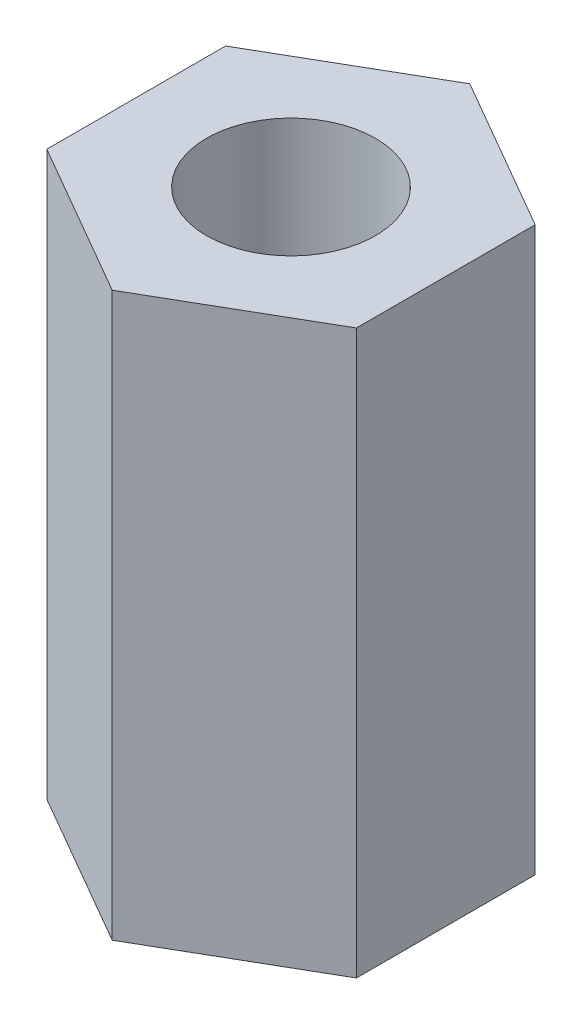
ISO-10303-21;
HEADER;
FILE_DESCRIPTION(('STEP AP214'),'2;1');
FILE_NAME('part.step','',(''),(''),'','','');
FILE_SCHEMA(('AUTOMOTIVE_DESIGN { 1 0 10303 214 1 1 1 1 }'));
ENDSEC;
DATA;
#1=APPLICATION_CONTEXT('core data for automotive mechanical design processes');
#2=APPLICATION_PROTOCOL_DEFINITION('international standard','automotive_design',2000,#1);
#3=PRODUCT_CONTEXT('',#1,'mechanical');
#4=PRODUCT('Part','Part','',(#3));
#5=PRODUCT_RELATED_PRODUCT_CATEGORY('part','',(#4));
#6=PRODUCT_DEFINITION_FORMATION('','',#4);
#7=PRODUCT_DEFINITION_CONTEXT('part definition',#1,'design');
#8=PRODUCT_DEFINITION('design','',#6,#7);
#9=PRODUCT_DEFINITION_SHAPE('','',#8);
#10=(LENGTH_UNIT() NAMED_UNIT(*) SI_UNIT(.MILLI.,.METRE.));
#11=(NAMED_UNIT(*) PLANE_ANGLE_UNIT() SI_UNIT($,.RADIAN.));
#12=(NAMED_UNIT(*) SI_UNIT($,.STERADIAN.) SOLID_ANGLE_UNIT());
#13=UNCERTAINTY_MEASURE_WITH_UNIT(LENGTH_MEASURE(1.E-05),#10,'distance_accuracy_value','');
#14=(GEOMETRIC_REPRESENTATION_CONTEXT(3) GLOBAL_UNCERTAINTY_ASSIGNED_CONTEXT((#13)) GLOBAL_UNIT_ASSIGNED_CONTEXT((#10,
#11,#12)) REPRESENTATION_CONTEXT('',''));
#15=CARTESIAN_POINT('',(0.,0.,0.));
#16=DIRECTION('',(0.,0.,1.));
#17=DIRECTION('',(1.,0.,0.));
#18=AXIS2_PLACEMENT_3D('',#15,#16,#17);
#19=CARTESIAN_POINT('',(0.,10.,0.));
#20=DIRECTION('',(0.,1.,0.));
#21=DIRECTION('',(0.,0.,1.));
#22=AXIS2_PLACEMENT_3D('',#19,#20,#21);
#23=PLANE('',#22);
#24=DIRECTION('',(-0.866025403784441,0.,-0.499999999999995));
#25=VECTOR('',#24,1.);
#26=CARTESIAN_POINT('',(2.74999999999998,10.,-1.5877132402715));
#27=LINE('',#26,#25);
#28=CARTESIAN_POINT('',(2.74999999999998,10.,-1.5877132402715));
#29=VERTEX_POINT('',#28);
#30=CARTESIAN_POINT('',(0.,10.,-3.17542648054294));
#31=VERTEX_POINT('',#30);
#32=EDGE_CURVE('E137',#29,#31,#27,.T.);
#33=ORIENTED_EDGE('',*,*,#32,.T.);
#34=DIRECTION('',(-0.866025403784438,0.,0.500000000000001));
#35=VECTOR('',#34,1.);
#36=CARTESIAN_POINT('',(0.,10.,-3.17542648054294));
#37=LINE('',#36,#35);
#38=CARTESIAN_POINT('',(-2.75,10.,-1.58771324027147));
#39=VERTEX_POINT('',#38);
#40=EDGE_CURVE('E95',#31,#39,#37,.T.);
#41=ORIENTED_EDGE('',*,*,#40,.T.);
#42=DIRECTION('',(0.,0.,1.));
#43=VECTOR('',#42,1.);
#44=CARTESIAN_POINT('',(-2.75,10.,-1.58771324027147));
#45=LINE('',#44,#43);
#46=CARTESIAN_POINT('',(-2.74999999999999,10.,1.58771324027148));
#47=VERTEX_POINT('',#46);
#48=EDGE_CURVE('E108',#39,#47,#45,.T.);
#49=ORIENTED_EDGE('',*,*,#48,.T.);
#50=DIRECTION('',(0.866025403784441,0.,0.499999999999995));
#51=VECTOR('',#50,1.);
#52=CARTESIAN_POINT('',(-2.74999999999999,10.,1.58771324027148));
#53=LINE('',#52,#51);
#54=CARTESIAN_POINT('',(0.,10.,3.17542648054294));
#55=VERTEX_POINT('',#54);
#56=EDGE_CURVE('E102',#47,#55,#53,.T.);
#57=ORIENTED_EDGE('',*,*,#56,.T.);
#58=DIRECTION('',(0.866025403784435,0.,-0.500000000000007));
#59=VECTOR('',#58,1.);
#60=CARTESIAN_POINT('',(0.,10.,3.17542648054294));
#61=LINE('',#60,#59);
#62=CARTESIAN_POINT('',(2.75000000000002,10.,1.58771324027145));
#63=VERTEX_POINT('',#62);
#64=EDGE_CURVE('E106',#55,#63,#61,.T.);
#65=ORIENTED_EDGE('',*,*,#64,.T.);
#66=DIRECTION('',(0.,0.,-1.));
#67=VECTOR('',#66,1.);
#68=CARTESIAN_POINT('',(2.75000000000002,10.,1.58771324027145));
#69=LINE('',#68,#67);
#70=EDGE_CURVE('E58',#63,#29,#69,.T.);
#71=ORIENTED_EDGE('',*,*,#70,.T.);
#72=EDGE_LOOP('',(#33,#41,#49,#57,#65,#71));
#73=FACE_BOUND('',#72,.T.);
#74=CARTESIAN_POINT('',(0.,10.,0.));
#75=DIRECTION('',(0.,1.,0.));
#76=DIRECTION('',(0.,0.,1.));
#77=AXIS2_PLACEMENT_3D('',#74,#75,#76);
#78=CIRCLE('',#77,1.5);
#79=CARTESIAN_POINT('',(0.,10.,1.5));
#80=VERTEX_POINT('',#79);
#81=EDGE_CURVE('E130',#80,#80,#78,.T.);
#82=ORIENTED_EDGE('',*,*,#81,.F.);
#83=EDGE_LOOP('',(#82));
#84=FACE_BOUND('',#83,.T.);
#85=ADVANCED_FACE('F41',(#73,#84),#23,.T.);
#86=CARTESIAN_POINT('',(0.,0.,0.));
#87=DIRECTION('',(0.,1.,0.));
#88=DIRECTION('',(0.,0.,1.));
#89=AXIS2_PLACEMENT_3D('',#86,#87,#88);
#90=PLANE('',#89);
#91=DIRECTION('',(-0.866025403784441,0.,-0.499999999999995));
#92=VECTOR('',#91,1.);
#93=CARTESIAN_POINT('',(2.74999999999998,0.,-1.5877132402715));
#94=LINE('',#93,#92);
#95=CARTESIAN_POINT('',(2.74999999999998,0.,-1.5877132402715));
#96=VERTEX_POINT('',#95);
#97=CARTESIAN_POINT('',(0.,0.,-3.17542648054294));
#98=VERTEX_POINT('',#97);
#99=EDGE_CURVE('E126',#96,#98,#94,.T.);
#100=ORIENTED_EDGE('',*,*,#99,.F.);
#101=DIRECTION('',(0.,0.,-1.));
#102=VECTOR('',#101,1.);
#103=CARTESIAN_POINT('',(2.75000000000002,0.,1.58771324027145));
#104=LINE('',#103,#102);
#105=CARTESIAN_POINT('',(2.75000000000002,0.,1.58771324027145));
#106=VERTEX_POINT('',#105);
#107=EDGE_CURVE('E87',#106,#96,#104,.T.);
#108=ORIENTED_EDGE('',*,*,#107,.F.);
#109=DIRECTION('',(0.866025403784435,0.,-0.500000000000007));
#110=VECTOR('',#109,1.);
#111=CARTESIAN_POINT('',(0.,0.,3.17542648054294));
#112=LINE('',#111,#110);
#113=CARTESIAN_POINT('',(0.,0.,3.17542648054294));
#114=VERTEX_POINT('',#113);
#115=EDGE_CURVE('E81',#114,#106,#112,.T.);
#116=ORIENTED_EDGE('',*,*,#115,.F.);
#117=DIRECTION('',(0.866025403784441,0.,0.499999999999995));
#118=VECTOR('',#117,1.);
#119=CARTESIAN_POINT('',(-2.74999999999999,0.,1.58771324027148));
#120=LINE('',#119,#118);
#121=CARTESIAN_POINT('',(-2.74999999999999,0.,1.58771324027148));
#122=VERTEX_POINT('',#121);
#123=EDGE_CURVE('E116',#122,#114,#120,.T.);
#124=ORIENTED_EDGE('',*,*,#123,.F.);
#125=DIRECTION('',(0.,0.,1.));
#126=VECTOR('',#125,1.);
#127=CARTESIAN_POINT('',(-2.75,0.,-1.58771324027147));
#128=LINE('',#127,#126);
#129=CARTESIAN_POINT('',(-2.75,0.,-1.58771324027147));
#130=VERTEX_POINT('',#129);
#131=EDGE_CURVE('E132',#130,#122,#128,.T.);
#132=ORIENTED_EDGE('',*,*,#131,.F.);
#133=DIRECTION('',(-0.866025403784438,0.,0.500000000000001));
#134=VECTOR('',#133,1.);
#135=CARTESIAN_POINT('',(0.,0.,-3.17542648054294));
#136=LINE('',#135,#134);
#137=EDGE_CURVE('E129',#98,#130,#136,.T.);
#138=ORIENTED_EDGE('',*,*,#137,.F.);
#139=EDGE_LOOP('',(#100,#108,#116,#124,#132,#138));
#140=FACE_BOUND('',#139,.T.);
#141=CARTESIAN_POINT('',(0.,0.,0.));
#142=DIRECTION('',(0.,1.,0.));
#143=DIRECTION('',(0.,0.,1.));
#144=AXIS2_PLACEMENT_3D('',#141,#142,#143);
#145=CIRCLE('',#144,1.5);
#146=CARTESIAN_POINT('',(0.,0.,1.5));
#147=VERTEX_POINT('',#146);
#148=EDGE_CURVE('E230',#147,#147,#145,.T.);
#149=ORIENTED_EDGE('',*,*,#148,.T.);
#150=EDGE_LOOP('',(#149));
#151=FACE_BOUND('',#150,.T.);
#152=ADVANCED_FACE('F146',(#140,#151),#90,.F.);
#153=CARTESIAN_POINT('',(2.74999999999998,10.,-1.5877132402715));
#154=DIRECTION('',(-0.499999999999995,0.,0.866025403784441));
#155=DIRECTION('',(0.866025403784441,0.,0.499999999999995));
#156=AXIS2_PLACEMENT_3D('',#153,#154,#155);
#157=PLANE('',#156);
#158=ORIENTED_EDGE('',*,*,#99,.T.);
#159=DIRECTION('',(0.,-1.,0.));
#160=VECTOR('',#159,1.);
#161=CARTESIAN_POINT('',(0.,10.,-3.17542648054294));
#162=LINE('',#161,#160);
#163=EDGE_CURVE('E11',#31,#98,#162,.T.);
#164=ORIENTED_EDGE('',*,*,#163,.F.);
#165=ORIENTED_EDGE('',*,*,#32,.F.);
#166=DIRECTION('',(0.,-1.,0.));
#167=VECTOR('',#166,1.);
#168=CARTESIAN_POINT('',(2.74999999999998,10.,-1.5877132402715));
#169=LINE('',#168,#167);
#170=EDGE_CURVE('E122',#29,#96,#169,.T.);
#171=ORIENTED_EDGE('',*,*,#170,.T.);
#172=EDGE_LOOP('',(#158,#164,#165,#171));
#173=FACE_BOUND('',#172,.T.);
#174=ADVANCED_FACE('F43',(#173),#157,.F.);
#175=CARTESIAN_POINT('',(0.,10.,-3.17542648054294));
#176=DIRECTION('',(0.500000000000001,0.,0.866025403784438));
#177=DIRECTION('',(0.866025403784438,0.,-0.500000000000001));
#178=AXIS2_PLACEMENT_3D('',#175,#176,#177);
#179=PLANE('',#178);
#180=ORIENTED_EDGE('',*,*,#137,.T.);
#181=DIRECTION('',(0.,-1.,0.));
#182=VECTOR('',#181,1.);
#183=CARTESIAN_POINT('',(-2.75,10.,-1.58771324027147));
#184=LINE('',#183,#182);
#185=EDGE_CURVE('E50',#39,#130,#184,.T.);
#186=ORIENTED_EDGE('',*,*,#185,.F.);
#187=ORIENTED_EDGE('',*,*,#40,.F.);
#188=ORIENTED_EDGE('',*,*,#163,.T.);
#189=EDGE_LOOP('',(#180,#186,#187,#188));
#190=FACE_BOUND('',#189,.T.);
#191=ADVANCED_FACE('F171',(#190),#179,.F.);
#192=CARTESIAN_POINT('',(-2.75,10.,-1.58771324027147));
#193=DIRECTION('',(1.,0.,0.));
#194=DIRECTION('',(0.,0.,-1.));
#195=AXIS2_PLACEMENT_3D('',#192,#193,#194);
#196=PLANE('',#195);
#197=ORIENTED_EDGE('',*,*,#131,.T.);
#198=DIRECTION('',(0.,-1.,0.));
#199=VECTOR('',#198,1.);
#200=CARTESIAN_POINT('',(-2.74999999999999,10.,1.58771324027148));
#201=LINE('',#200,#199);
#202=EDGE_CURVE('E117',#47,#122,#201,.T.);
#203=ORIENTED_EDGE('',*,*,#202,.F.);
#204=ORIENTED_EDGE('',*,*,#48,.F.);
#205=ORIENTED_EDGE('',*,*,#185,.T.);
#206=EDGE_LOOP('',(#197,#203,#204,#205));
#207=FACE_BOUND('',#206,.T.);
#208=ADVANCED_FACE('F143',(#207),#196,.F.);
#209=CARTESIAN_POINT('',(-2.74999999999999,10.,1.58771324027148));
#210=DIRECTION('',(0.499999999999995,0.,-0.866025403784442));
#211=DIRECTION('',(-0.866025403784442,0.,-0.499999999999995));
#212=AXIS2_PLACEMENT_3D('',#209,#210,#211);
#213=PLANE('',#212);
#214=ORIENTED_EDGE('',*,*,#123,.T.);
#215=DIRECTION('',(0.,-1.,0.));
#216=VECTOR('',#215,1.);
#217=CARTESIAN_POINT('',(0.,10.,3.17542648054294));
#218=LINE('',#217,#216);
#219=EDGE_CURVE('E113',#55,#114,#218,.T.);
#220=ORIENTED_EDGE('',*,*,#219,.F.);
#221=ORIENTED_EDGE('',*,*,#56,.F.);
#222=ORIENTED_EDGE('',*,*,#202,.T.);
#223=EDGE_LOOP('',(#214,#220,#221,#222));
#224=FACE_BOUND('',#223,.T.);
#225=ADVANCED_FACE('F114',(#224),#213,.F.);
#226=CARTESIAN_POINT('',(0.,10.,3.17542648054294));
#227=DIRECTION('',(-0.500000000000007,0.,-0.866025403784435));
#228=DIRECTION('',(-0.866025403784435,0.,0.500000000000007));
#229=AXIS2_PLACEMENT_3D('',#226,#227,#228);
#230=PLANE('',#229);
#231=ORIENTED_EDGE('',*,*,#115,.T.);
#232=DIRECTION('',(0.,-1.,0.));
#233=VECTOR('',#232,1.);
#234=CARTESIAN_POINT('',(2.75000000000002,10.,1.58771324027145));
#235=LINE('',#234,#233);
#236=EDGE_CURVE('E118',#63,#106,#235,.T.);
#237=ORIENTED_EDGE('',*,*,#236,.F.);
#238=ORIENTED_EDGE('',*,*,#64,.F.);
#239=ORIENTED_EDGE('',*,*,#219,.T.);
#240=EDGE_LOOP('',(#231,#237,#238,#239));
#241=FACE_BOUND('',#240,.T.);
#242=ADVANCED_FACE('F120',(#241),#230,.F.);
#243=CARTESIAN_POINT('',(2.75000000000002,10.,1.58771324027145));
#244=DIRECTION('',(-1.,0.,0.));
#245=DIRECTION('',(0.,0.,1.));
#246=AXIS2_PLACEMENT_3D('',#243,#244,#245);
#247=PLANE('',#246);
#248=ORIENTED_EDGE('',*,*,#107,.T.);
#249=ORIENTED_EDGE('',*,*,#170,.F.);
#250=ORIENTED_EDGE('',*,*,#70,.F.);
#251=ORIENTED_EDGE('',*,*,#236,.T.);
#252=EDGE_LOOP('',(#248,#249,#250,#251));
#253=FACE_BOUND('',#252,.T.);
#254=ADVANCED_FACE('F151',(#253),#247,.F.);
#255=CARTESIAN_POINT('',(0.,10.,0.));
#256=DIRECTION('',(0.,-1.,0.));
#257=DIRECTION('',(0.,0.,-1.));
#258=AXIS2_PLACEMENT_3D('',#255,#256,#257);
#259=CYLINDRICAL_SURFACE('',#258,1.5);
#260=ORIENTED_EDGE('',*,*,#81,.T.);
#261=EDGE_LOOP('',(#260));
#262=FACE_BOUND('',#261,.T.);
#263=ORIENTED_EDGE('',*,*,#148,.F.);
#264=EDGE_LOOP('',(#263));
#265=FACE_BOUND('',#264,.T.);
#266=ADVANCED_FACE('F153',(#262,#265),#259,.F.);
#267=CLOSED_SHELL('',(#85,#152,#174,#191,#208,#225,#242,#254,#266));
#268=MANIFOLD_SOLID_BREP('B2',#267);
#269=ADVANCED_BREP_SHAPE_REPRESENTATION('',(#18,#268),#14);
#270=SHAPE_DEFINITION_REPRESENTATION(#9,#269);
ENDSEC;
END-ISO-10303-21;
